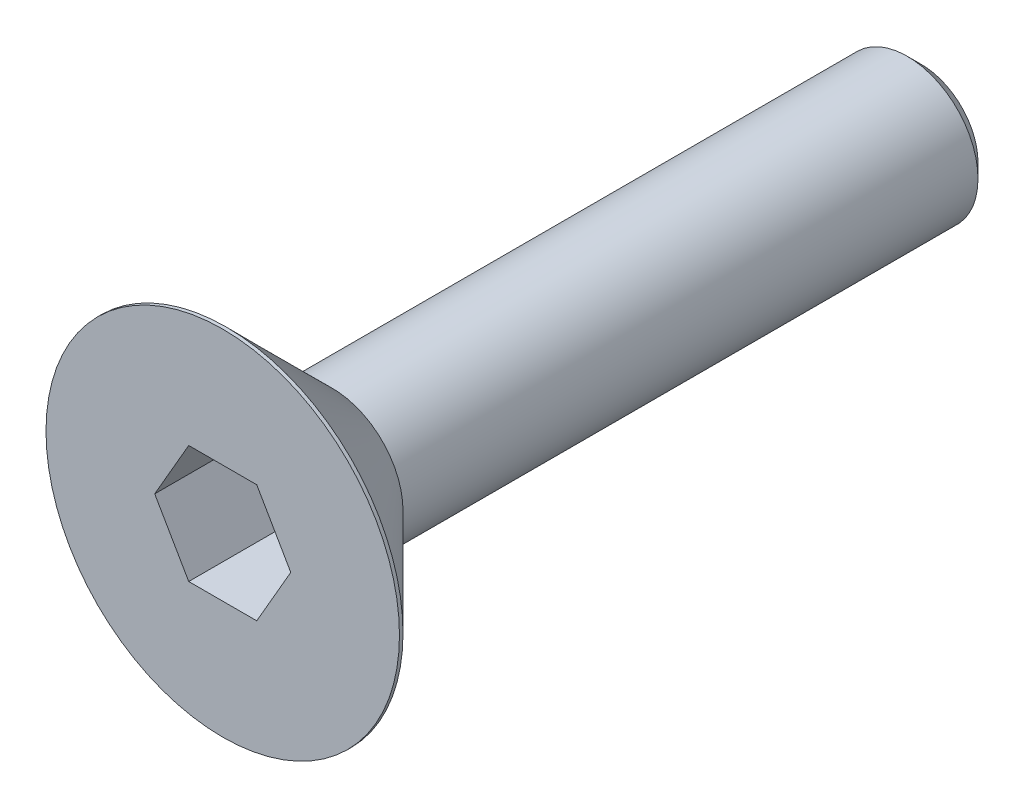
ISO-10303-21;
HEADER;
FILE_DESCRIPTION(('STEP AP214'),'2;1');
FILE_NAME('part.step','',(''),(''),'','','');
FILE_SCHEMA(('AUTOMOTIVE_DESIGN { 1 0 10303 214 1 1 1 1 }'));
ENDSEC;
DATA;
#1=APPLICATION_CONTEXT('core data for automotive mechanical design processes');
#2=APPLICATION_PROTOCOL_DEFINITION('international standard','automotive_design',2000,#1);
#3=PRODUCT_CONTEXT('',#1,'mechanical');
#4=PRODUCT('Part','Part','',(#3));
#5=PRODUCT_RELATED_PRODUCT_CATEGORY('part','',(#4));
#6=PRODUCT_DEFINITION_FORMATION('','',#4);
#7=PRODUCT_DEFINITION_CONTEXT('part definition',#1,'design');
#8=PRODUCT_DEFINITION('design','',#6,#7);
#9=PRODUCT_DEFINITION_SHAPE('','',#8);
#10=(LENGTH_UNIT() NAMED_UNIT(*) SI_UNIT(.MILLI.,.METRE.));
#11=(NAMED_UNIT(*) PLANE_ANGLE_UNIT() SI_UNIT($,.RADIAN.));
#12=(NAMED_UNIT(*) SI_UNIT($,.STERADIAN.) SOLID_ANGLE_UNIT());
#13=UNCERTAINTY_MEASURE_WITH_UNIT(LENGTH_MEASURE(1.E-05),#10,'distance_accuracy_value','');
#14=(GEOMETRIC_REPRESENTATION_CONTEXT(3) GLOBAL_UNCERTAINTY_ASSIGNED_CONTEXT((#13)) GLOBAL_UNIT_ASSIGNED_CONTEXT((#10,
#11,#12)) REPRESENTATION_CONTEXT('',''));
#15=CARTESIAN_POINT('',(0.,0.,0.));
#16=DIRECTION('',(0.,0.,1.));
#17=DIRECTION('',(1.,0.,0.));
#18=AXIS2_PLACEMENT_3D('',#15,#16,#17);
#19=CARTESIAN_POINT('',(1.15470053837925,0.,0.));
#20=DIRECTION('',(0.,0.,1.));
#21=DIRECTION('',(1.,0.,0.));
#22=AXIS2_PLACEMENT_3D('',#19,#20,#21);
#23=PLANE('',#22);
#24=DIRECTION('',(-0.5,0.866025403784438,0.));
#25=VECTOR('',#24,1.);
#26=CARTESIAN_POINT('',(1.15470053837925,0.,-8.14347525313816E-11));
#27=LINE('',#26,#25);
#28=CARTESIAN_POINT('',(1.15470053827949,0.,-6.06737946021818E-11));
#29=VERTEX_POINT('',#28);
#30=CARTESIAN_POINT('',(0.577350269139744,0.999999999913599,-6.06737946021818E-11));
#31=VERTEX_POINT('',#30);
#32=EDGE_CURVE('E135',#29,#31,#27,.T.);
#33=ORIENTED_EDGE('',*,*,#32,.T.);
#34=CARTESIAN_POINT('',(0.,0.,-6.06737946021818E-11));
#35=DIRECTION('',(0.,0.,1.));
#36=DIRECTION('',(1.,0.,0.));
#37=AXIS2_PLACEMENT_3D('',#34,#35,#36);
#38=CIRCLE('',#37,1.15470053827949);
#39=EDGE_CURVE('E86',#31,#29,#38,.F.);
#40=ORIENTED_EDGE('',*,*,#39,.T.);
#41=EDGE_LOOP('',(#33,#40));
#42=FACE_BOUND('',#41,.T.);
#43=ADVANCED_FACE('F16',(#42),#23,.F.);
#44=CARTESIAN_POINT('',(1.15470053837925,0.,0.));
#45=DIRECTION('',(0.,0.,1.));
#46=DIRECTION('',(1.,0.,0.));
#47=AXIS2_PLACEMENT_3D('',#44,#45,#46);
#48=PLANE('',#47);
#49=DIRECTION('',(-1.,0.,0.));
#50=VECTOR('',#49,1.);
#51=CARTESIAN_POINT('',(0.577350269189626,0.999999999999999,-5.6843418860808E-11));
#52=LINE('',#51,#50);
#53=CARTESIAN_POINT('',(-0.577350269139742,0.9999999999136,-6.06737946021818E-11));
#54=VERTEX_POINT('',#53);
#55=EDGE_CURVE('E69',#31,#54,#52,.T.);
#56=ORIENTED_EDGE('',*,*,#55,.T.);
#57=CARTESIAN_POINT('',(0.,0.,-6.06737946021818E-11));
#58=DIRECTION('',(0.,0.,1.));
#59=DIRECTION('',(1.,0.,0.));
#60=AXIS2_PLACEMENT_3D('',#57,#58,#59);
#61=CIRCLE('',#60,1.15470053827949);
#62=EDGE_CURVE('E19',#54,#31,#61,.F.);
#63=ORIENTED_EDGE('',*,*,#62,.T.);
#64=EDGE_LOOP('',(#56,#63));
#65=FACE_BOUND('',#64,.T.);
#66=ADVANCED_FACE('F71',(#65),#48,.F.);
#67=CARTESIAN_POINT('',(1.15470053837925,0.,0.));
#68=DIRECTION('',(0.,0.,1.));
#69=DIRECTION('',(1.,0.,0.));
#70=AXIS2_PLACEMENT_3D('',#67,#68,#69);
#71=PLANE('',#70);
#72=DIRECTION('',(0.5,0.866025403784439,0.));
#73=VECTOR('',#72,1.);
#74=CARTESIAN_POINT('',(0.577350269189626,-1.,-8.14348536457369E-11));
#75=LINE('',#74,#73);
#76=CARTESIAN_POINT('',(0.577350269139742,-0.9999999999136,-6.06737946021818E-11));
#77=VERTEX_POINT('',#76);
#78=EDGE_CURVE('E121',#77,#29,#75,.T.);
#79=ORIENTED_EDGE('',*,*,#78,.T.);
#80=CARTESIAN_POINT('',(0.,0.,-6.06737946021818E-11));
#81=DIRECTION('',(0.,0.,1.));
#82=DIRECTION('',(1.,0.,0.));
#83=AXIS2_PLACEMENT_3D('',#80,#81,#82);
#84=CIRCLE('',#83,1.15470053827949);
#85=EDGE_CURVE('E100',#29,#77,#84,.F.);
#86=ORIENTED_EDGE('',*,*,#85,.T.);
#87=EDGE_LOOP('',(#79,#86));
#88=FACE_BOUND('',#87,.T.);
#89=ADVANCED_FACE('F172',(#88),#71,.F.);
#90=CARTESIAN_POINT('',(1.15470053837925,0.,0.));
#91=DIRECTION('',(0.866025403784438,0.5,0.));
#92=DIRECTION('',(-0.5,0.866025403784438,0.));
#93=AXIS2_PLACEMENT_3D('',#90,#91,#92);
#94=PLANE('',#93);
#95=DIRECTION('',(0.,0.,1.));
#96=VECTOR('',#95,1.);
#97=CARTESIAN_POINT('',(0.577350269190617,0.999999999999999,0.));
#98=LINE('',#97,#96);
#99=CARTESIAN_POINT('',(0.577350269203338,0.999999999977395,1.86));
#100=VERTEX_POINT('',#99);
#101=EDGE_CURVE('E77',#100,#31,#98,.F.);
#102=ORIENTED_EDGE('',*,*,#101,.T.);
#103=ORIENTED_EDGE('',*,*,#32,.F.);
#104=DIRECTION('',(0.,0.,1.));
#105=VECTOR('',#104,1.);
#106=CARTESIAN_POINT('',(1.1547005383401,-6.78129427611474E-11,0.));
#107=LINE('',#106,#105);
#108=CARTESIAN_POINT('',(1.15470053836516,-4.34021162487844E-11,1.86));
#109=VERTEX_POINT('',#108);
#110=EDGE_CURVE('E124',#29,#109,#107,.T.);
#111=ORIENTED_EDGE('',*,*,#110,.T.);
#112=DIRECTION('',(-0.5,0.866025403784438,0.));
#113=VECTOR('',#112,1.);
#114=CARTESIAN_POINT('',(1.15470053837925,0.,1.86));
#115=LINE('',#114,#113);
#116=EDGE_CURVE('E138',#100,#109,#115,.F.);
#117=ORIENTED_EDGE('',*,*,#116,.F.);
#118=EDGE_LOOP('',(#102,#103,#111,#117));
#119=FACE_BOUND('',#118,.T.);
#120=ADVANCED_FACE('F170',(#119),#94,.F.);
#121=CARTESIAN_POINT('',(0.577350269189626,0.999999999999999,0.));
#122=DIRECTION('',(0.,1.,0.));
#123=DIRECTION('',(-1.,0.,0.));
#124=AXIS2_PLACEMENT_3D('',#121,#122,#123);
#125=PLANE('',#124);
#126=DIRECTION('',(0.,0.,1.));
#127=VECTOR('',#126,1.);
#128=CARTESIAN_POINT('',(-0.577350269183825,1.00000000001005,0.));
#129=LINE('',#128,#127);
#130=CARTESIAN_POINT('',(-0.577350269159657,1.0000000000067,1.86));
#131=VERTEX_POINT('',#130);
#132=EDGE_CURVE('E88',#131,#54,#129,.F.);
#133=ORIENTED_EDGE('',*,*,#132,.T.);
#134=ORIENTED_EDGE('',*,*,#55,.F.);
#135=ORIENTED_EDGE('',*,*,#101,.F.);
#136=DIRECTION('',(-1.,0.,0.));
#137=VECTOR('',#136,1.);
#138=CARTESIAN_POINT('',(0.577350269189626,0.999999999999999,1.86));
#139=LINE('',#138,#137);
#140=EDGE_CURVE('E76',#131,#100,#139,.F.);
#141=ORIENTED_EDGE('',*,*,#140,.F.);
#142=EDGE_LOOP('',(#133,#134,#135,#141));
#143=FACE_BOUND('',#142,.T.);
#144=ADVANCED_FACE('F89',(#143),#125,.F.);
#145=CARTESIAN_POINT('',(1.15470053837925,0.,0.));
#146=DIRECTION('',(0.,0.,1.));
#147=DIRECTION('',(1.,0.,0.));
#148=AXIS2_PLACEMENT_3D('',#145,#146,#147);
#149=PLANE('',#148);
#150=DIRECTION('',(-0.5,-0.866025403784438,0.));
#151=VECTOR('',#150,1.);
#152=CARTESIAN_POINT('',(-0.577350269189625,1.,-5.6843418860808E-11));
#153=LINE('',#152,#151);
#154=CARTESIAN_POINT('',(-1.15470053827949,0.,-6.06737946021818E-11));
#155=VERTEX_POINT('',#154);
#156=EDGE_CURVE('E94',#54,#155,#153,.T.);
#157=ORIENTED_EDGE('',*,*,#156,.T.);
#158=CARTESIAN_POINT('',(0.,0.,-6.06737946021818E-11));
#159=DIRECTION('',(0.,0.,1.));
#160=DIRECTION('',(1.,0.,0.));
#161=AXIS2_PLACEMENT_3D('',#158,#159,#160);
#162=CIRCLE('',#161,1.15470053827949);
#163=EDGE_CURVE('E83',#54,#155,#162,.T.);
#164=ORIENTED_EDGE('',*,*,#163,.F.);
#165=EDGE_LOOP('',(#157,#164));
#166=FACE_BOUND('',#165,.T.);
#167=ADVANCED_FACE('F98',(#166),#149,.F.);
#168=CARTESIAN_POINT('',(0.,0.,-1.13686837721616E-10));
#169=DIRECTION('',(0.,0.,1.));
#170=DIRECTION('',(1.,0.,0.));
#171=AXIS2_PLACEMENT_3D('',#168,#169,#170);
#172=CONICAL_SURFACE('',#171,1.1547005381658,1.13446401337423);
#173=CARTESIAN_POINT('',(1.13686837721616E-10,0.,-0.538445704393098));
#174=VERTEX_POINT('',#173);
#175=VERTEX_LOOP('',#174);
#176=FACE_BOUND('',#175,.T.);
#177=ORIENTED_EDGE('',*,*,#163,.T.);
#178=CARTESIAN_POINT('',(0.,0.,-6.06737946021818E-11));
#179=DIRECTION('',(0.,0.,1.));
#180=DIRECTION('',(1.,0.,0.));
#181=AXIS2_PLACEMENT_3D('',#178,#179,#180);
#182=CIRCLE('',#181,1.15470053827949);
#183=CARTESIAN_POINT('',(-0.577350269139742,-0.9999999999136,-6.06737946021818E-11));
#184=VERTEX_POINT('',#183);
#185=EDGE_CURVE('E108',#155,#184,#182,.T.);
#186=ORIENTED_EDGE('',*,*,#185,.T.);
#187=CARTESIAN_POINT('',(0.,0.,-6.06737946021818E-11));
#188=DIRECTION('',(0.,0.,1.));
#189=DIRECTION('',(1.,0.,0.));
#190=AXIS2_PLACEMENT_3D('',#187,#188,#189);
#191=CIRCLE('',#190,1.15470053827949);
#192=EDGE_CURVE('E125',#184,#77,#191,.T.);
#193=ORIENTED_EDGE('',*,*,#192,.T.);
#194=ORIENTED_EDGE('',*,*,#85,.F.);
#195=ORIENTED_EDGE('',*,*,#39,.F.);
#196=ORIENTED_EDGE('',*,*,#62,.F.);
#197=EDGE_LOOP('',(#177,#186,#193,#194,#195,#196));
#198=FACE_BOUND('',#197,.T.);
#199=ADVANCED_FACE('F81',(#176,#198),#172,.F.);
#200=CARTESIAN_POINT('',(1.15470053837925,0.,0.));
#201=DIRECTION('',(0.,0.,1.));
#202=DIRECTION('',(1.,0.,0.));
#203=AXIS2_PLACEMENT_3D('',#200,#201,#202);
#204=PLANE('',#203);
#205=DIRECTION('',(1.,0.,0.));
#206=VECTOR('',#205,1.);
#207=CARTESIAN_POINT('',(-0.577350269189625,-1.,-8.14348536457369E-11));
#208=LINE('',#207,#206);
#209=EDGE_CURVE('E128',#184,#77,#208,.T.);
#210=ORIENTED_EDGE('',*,*,#209,.T.);
#211=ORIENTED_EDGE('',*,*,#192,.F.);
#212=EDGE_LOOP('',(#210,#211));
#213=FACE_BOUND('',#212,.T.);
#214=ADVANCED_FACE('F178',(#213),#204,.F.);
#215=CARTESIAN_POINT('',(0.577350269189626,-1.,0.));
#216=DIRECTION('',(0.866025403784439,-0.5,0.));
#217=DIRECTION('',(0.5,0.866025403784439,0.));
#218=AXIS2_PLACEMENT_3D('',#215,#216,#217);
#219=PLANE('',#218);
#220=ORIENTED_EDGE('',*,*,#110,.F.);
#221=ORIENTED_EDGE('',*,*,#78,.F.);
#222=DIRECTION('',(0.,0.,-1.));
#223=VECTOR('',#222,1.);
#224=CARTESIAN_POINT('',(0.577350269111321,-1.,0.));
#225=LINE('',#224,#223);
#226=CARTESIAN_POINT('',(0.577350269164597,-1.00000000000356,1.86));
#227=VERTEX_POINT('',#226);
#228=EDGE_CURVE('E126',#77,#227,#225,.F.);
#229=ORIENTED_EDGE('',*,*,#228,.T.);
#230=DIRECTION('',(0.5,0.866025403784439,0.));
#231=VECTOR('',#230,1.);
#232=CARTESIAN_POINT('',(0.577350269189626,-1.,1.86));
#233=LINE('',#232,#231);
#234=EDGE_CURVE('E95',#109,#227,#233,.F.);
#235=ORIENTED_EDGE('',*,*,#234,.F.);
#236=EDGE_LOOP('',(#220,#221,#229,#235));
#237=FACE_BOUND('',#236,.T.);
#238=ADVANCED_FACE('F167',(#237),#219,.F.);
#239=CARTESIAN_POINT('',(-0.577350269189625,1.,0.));
#240=DIRECTION('',(-0.866025403784438,0.5,0.));
#241=DIRECTION('',(-0.5,-0.866025403784438,0.));
#242=AXIS2_PLACEMENT_3D('',#239,#240,#241);
#243=PLANE('',#242);
#244=DIRECTION('',(0.,0.,1.));
#245=VECTOR('',#244,1.);
#246=CARTESIAN_POINT('',(-1.15470053838237,5.40021729027993E-12,0.));
#247=LINE('',#246,#245);
#248=CARTESIAN_POINT('',(-1.15470053837769,6.30030652750131E-12,1.86));
#249=VERTEX_POINT('',#248);
#250=EDGE_CURVE('E104',#249,#155,#247,.F.);
#251=ORIENTED_EDGE('',*,*,#250,.T.);
#252=ORIENTED_EDGE('',*,*,#156,.F.);
#253=ORIENTED_EDGE('',*,*,#132,.F.);
#254=DIRECTION('',(-0.5,-0.866025403784438,0.));
#255=VECTOR('',#254,1.);
#256=CARTESIAN_POINT('',(-0.577350269189625,1.,1.86));
#257=LINE('',#256,#255);
#258=EDGE_CURVE('E106',#249,#131,#257,.F.);
#259=ORIENTED_EDGE('',*,*,#258,.F.);
#260=EDGE_LOOP('',(#251,#252,#253,#259));
#261=FACE_BOUND('',#260,.T.);
#262=ADVANCED_FACE('F102',(#261),#243,.F.);
#263=CARTESIAN_POINT('',(1.15470053837925,0.,0.));
#264=DIRECTION('',(0.,0.,1.));
#265=DIRECTION('',(1.,0.,0.));
#266=AXIS2_PLACEMENT_3D('',#263,#264,#265);
#267=PLANE('',#266);
#268=DIRECTION('',(0.5,-0.866025403784439,0.));
#269=VECTOR('',#268,1.);
#270=CARTESIAN_POINT('',(-1.15470053837925,0.,-5.6843418860808E-11));
#271=LINE('',#270,#269);
#272=EDGE_CURVE('E182',#155,#184,#271,.T.);
#273=ORIENTED_EDGE('',*,*,#272,.T.);
#274=ORIENTED_EDGE('',*,*,#185,.F.);
#275=EDGE_LOOP('',(#273,#274));
#276=FACE_BOUND('',#275,.T.);
#277=ADVANCED_FACE('F275',(#276),#267,.F.);
#278=CARTESIAN_POINT('',(-0.577350269189625,-1.,0.));
#279=DIRECTION('',(0.,-1.,0.));
#280=DIRECTION('',(0.,0.,-1.));
#281=AXIS2_PLACEMENT_3D('',#278,#279,#280);
#282=PLANE('',#281);
#283=ORIENTED_EDGE('',*,*,#228,.F.);
#284=ORIENTED_EDGE('',*,*,#209,.F.);
#285=DIRECTION('',(0.,0.,1.));
#286=VECTOR('',#285,1.);
#287=CARTESIAN_POINT('',(-0.577350269228777,-0.999999999932186,0.));
#288=LINE('',#287,#286);
#289=CARTESIAN_POINT('',(-0.577350269199893,-0.999999999983252,1.86));
#290=VERTEX_POINT('',#289);
#291=EDGE_CURVE('E111',#184,#290,#288,.T.);
#292=ORIENTED_EDGE('',*,*,#291,.T.);
#293=DIRECTION('',(1.,0.,0.));
#294=VECTOR('',#293,1.);
#295=CARTESIAN_POINT('',(-0.577350269189625,-1.,1.86));
#296=LINE('',#295,#294);
#297=EDGE_CURVE('E34',#227,#290,#296,.F.);
#298=ORIENTED_EDGE('',*,*,#297,.F.);
#299=EDGE_LOOP('',(#283,#284,#292,#298));
#300=FACE_BOUND('',#299,.T.);
#301=ADVANCED_FACE('F265',(#300),#282,.F.);
#302=CARTESIAN_POINT('',(-1.15470053837925,0.,0.));
#303=DIRECTION('',(-0.866025403784439,-0.5,0.));
#304=DIRECTION('',(0.5,-0.866025403784439,0.));
#305=AXIS2_PLACEMENT_3D('',#302,#303,#304);
#306=PLANE('',#305);
#307=ORIENTED_EDGE('',*,*,#291,.F.);
#308=ORIENTED_EDGE('',*,*,#272,.F.);
#309=ORIENTED_EDGE('',*,*,#250,.F.);
#310=DIRECTION('',(-0.499999999990956,0.86602540378966,0.));
#311=VECTOR('',#310,1.);
#312=CARTESIAN_POINT('',(-0.577350269190096,-1.0000000000017,1.86));
#313=LINE('',#312,#311);
#314=EDGE_CURVE('E116',#290,#249,#313,.T.);
#315=ORIENTED_EDGE('',*,*,#314,.F.);
#316=EDGE_LOOP('',(#307,#308,#309,#315));
#317=FACE_BOUND('',#316,.T.);
#318=ADVANCED_FACE('F216',(#317),#306,.F.);
#319=CARTESIAN_POINT('',(0.,0.,1.86));
#320=DIRECTION('',(0.,0.,1.));
#321=DIRECTION('',(1.,0.,0.));
#322=AXIS2_PLACEMENT_3D('',#319,#320,#321);
#323=PLANE('',#322);
#324=CARTESIAN_POINT('',(0.,0.,1.86));
#325=DIRECTION('',(0.,0.,-1.));
#326=DIRECTION('',(-1.,0.,0.));
#327=AXIS2_PLACEMENT_3D('',#324,#325,#326);
#328=CIRCLE('',#327,3.);
#329=CARTESIAN_POINT('',(-3.,0.,1.86));
#330=VERTEX_POINT('',#329);
#331=EDGE_CURVE('E118',#330,#330,#328,.T.);
#332=ORIENTED_EDGE('',*,*,#331,.F.);
#333=EDGE_LOOP('',(#332));
#334=FACE_BOUND('',#333,.T.);
#335=ORIENTED_EDGE('',*,*,#297,.T.);
#336=ORIENTED_EDGE('',*,*,#314,.T.);
#337=ORIENTED_EDGE('',*,*,#258,.T.);
#338=ORIENTED_EDGE('',*,*,#140,.T.);
#339=ORIENTED_EDGE('',*,*,#116,.T.);
#340=ORIENTED_EDGE('',*,*,#234,.T.);
#341=EDGE_LOOP('',(#335,#336,#337,#338,#339,#340));
#342=FACE_BOUND('',#341,.T.);
#343=ADVANCED_FACE('F207',(#334,#342),#323,.T.);
#344=CARTESIAN_POINT('',(0.,0.,-10.));
#345=DIRECTION('',(0.,0.,-1.));
#346=DIRECTION('',(-1.,0.,0.));
#347=AXIS2_PLACEMENT_3D('',#344,#345,#346);
#348=PLANE('',#347);
#349=CARTESIAN_POINT('',(0.,0.,-9.99999999999091));
#350=DIRECTION('',(0.,0.,1.));
#351=DIRECTION('',(1.,0.,0.));
#352=AXIS2_PLACEMENT_3D('',#349,#350,#351);
#353=CIRCLE('',#352,0.959999999963657);
#354=CARTESIAN_POINT('',(0.959999999963657,0.,-9.99999999999091));
#355=VERTEX_POINT('',#354);
#356=EDGE_CURVE('E152',#355,#355,#353,.T.);
#357=ORIENTED_EDGE('',*,*,#356,.F.);
#358=EDGE_LOOP('',(#357));
#359=FACE_BOUND('',#358,.T.);
#360=ADVANCED_FACE('F205',(#359),#348,.T.);
#361=CARTESIAN_POINT('',(0.,0.,1.86));
#362=DIRECTION('',(0.,0.,-1.));
#363=DIRECTION('',(-1.,0.,0.));
#364=AXIS2_PLACEMENT_3D('',#361,#362,#363);
#365=CYLINDRICAL_SURFACE('',#364,3.);
#366=ORIENTED_EDGE('',*,*,#331,.T.);
#367=EDGE_LOOP('',(#366));
#368=FACE_BOUND('',#367,.T.);
#369=CARTESIAN_POINT('',(0.,0.,1.79999999988922));
#370=DIRECTION('',(0.,0.,1.));
#371=DIRECTION('',(0.,-1.,0.));
#372=AXIS2_PLACEMENT_3D('',#369,#370,#371);
#373=CIRCLE('',#372,3.00000000004275);
#374=CARTESIAN_POINT('',(0.,-3.00000000004275,1.79999999988922));
#375=VERTEX_POINT('',#374);
#376=EDGE_CURVE('E155',#375,#375,#373,.F.);
#377=ORIENTED_EDGE('',*,*,#376,.F.);
#378=EDGE_LOOP('',(#377));
#379=FACE_BOUND('',#378,.T.);
#380=ADVANCED_FACE('F201',(#368,#379),#365,.T.);
#381=CARTESIAN_POINT('',(0.,0.,-9.76000000008526));
#382=DIRECTION('',(0.,0.,1.));
#383=DIRECTION('',(1.,0.,0.));
#384=AXIS2_PLACEMENT_3D('',#381,#382,#383);
#385=CONICAL_SURFACE('',#384,1.19999999986931,0.785398163397448);
#386=CARTESIAN_POINT('',(0.,0.,-9.76));
#387=DIRECTION('',(0.,0.,1.));
#388=DIRECTION('',(1.,0.,0.));
#389=AXIS2_PLACEMENT_3D('',#386,#387,#388);
#390=CIRCLE('',#389,1.2);
#391=CARTESIAN_POINT('',(1.2,0.,-9.76));
#392=VERTEX_POINT('',#391);
#393=EDGE_CURVE('E25',#392,#392,#390,.T.);
#394=ORIENTED_EDGE('',*,*,#393,.F.);
#395=EDGE_LOOP('',(#394));
#396=FACE_BOUND('',#395,.T.);
#397=ORIENTED_EDGE('',*,*,#356,.T.);
#398=EDGE_LOOP('',(#397));
#399=FACE_BOUND('',#398,.T.);
#400=ADVANCED_FACE('F197',(#396,#399),#385,.T.);
#401=CARTESIAN_POINT('',(0.,0.,1.79999999988922));
#402=DIRECTION('',(0.,0.,1.));
#403=DIRECTION('',(0.,-1.,0.));
#404=AXIS2_PLACEMENT_3D('',#401,#402,#403);
#405=CONICAL_SURFACE('',#404,3.00000000004275,0.785398163413238);
#406=ORIENTED_EDGE('',*,*,#376,.T.);
#407=EDGE_LOOP('',(#406));
#408=FACE_BOUND('',#407,.T.);
#409=CARTESIAN_POINT('',(0.,0.,0.));
#410=DIRECTION('',(0.,0.,1.));
#411=DIRECTION('',(1.,0.,0.));
#412=AXIS2_PLACEMENT_3D('',#409,#410,#411);
#413=CIRCLE('',#412,1.2);
#414=CARTESIAN_POINT('',(1.2,0.,0.));
#415=VERTEX_POINT('',#414);
#416=EDGE_CURVE('E11',#415,#415,#413,.F.);
#417=ORIENTED_EDGE('',*,*,#416,.F.);
#418=EDGE_LOOP('',(#417));
#419=FACE_BOUND('',#418,.T.);
#420=ADVANCED_FACE('F200',(#408,#419),#405,.T.);
#421=CARTESIAN_POINT('',(0.,0.,-10.));
#422=DIRECTION('',(0.,0.,1.));
#423=DIRECTION('',(1.,0.,0.));
#424=AXIS2_PLACEMENT_3D('',#421,#422,#423);
#425=CYLINDRICAL_SURFACE('',#424,1.2);
#426=ORIENTED_EDGE('',*,*,#416,.T.);
#427=EDGE_LOOP('',(#426));
#428=FACE_BOUND('',#427,.T.);
#429=ORIENTED_EDGE('',*,*,#393,.T.);
#430=EDGE_LOOP('',(#429));
#431=FACE_BOUND('',#430,.T.);
#432=ADVANCED_FACE('F195',(#428,#431),#425,.T.);
#433=CLOSED_SHELL('',(#43,#66,#89,#120,#144,#167,#199,#214,#238,#262,#277,#301,#318,#343,#360,
#380,#400,#420,#432));
#434=MANIFOLD_SOLID_BREP('B1',#433);
#435=ADVANCED_BREP_SHAPE_REPRESENTATION('',(#18,#434),#14);
#436=SHAPE_DEFINITION_REPRESENTATION(#9,#435);
ENDSEC;
END-ISO-10303-21;
